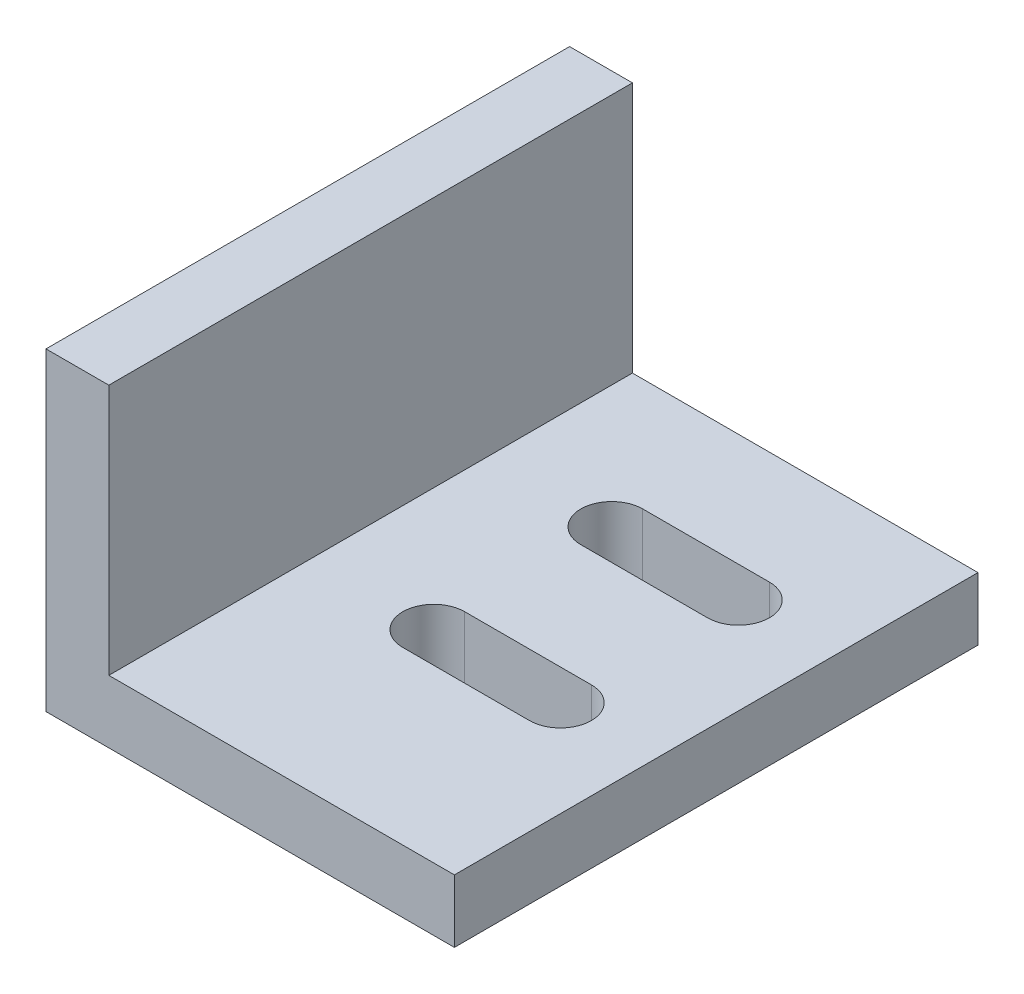
ISO-10303-21;
HEADER;
FILE_DESCRIPTION(('STEP AP214'),'2;1');
FILE_NAME('part.step','',(''),(''),'','','');
FILE_SCHEMA(('AUTOMOTIVE_DESIGN { 1 0 10303 214 1 1 1 1 }'));
ENDSEC;
DATA;
#1=APPLICATION_CONTEXT('core data for automotive mechanical design processes');
#2=APPLICATION_PROTOCOL_DEFINITION('international standard','automotive_design',2000,#1);
#3=PRODUCT_CONTEXT('',#1,'mechanical');
#4=PRODUCT('Part','Part','',(#3));
#5=PRODUCT_RELATED_PRODUCT_CATEGORY('part','',(#4));
#6=PRODUCT_DEFINITION_FORMATION('','',#4);
#7=PRODUCT_DEFINITION_CONTEXT('part definition',#1,'design');
#8=PRODUCT_DEFINITION('design','',#6,#7);
#9=PRODUCT_DEFINITION_SHAPE('','',#8);
#10=(LENGTH_UNIT() NAMED_UNIT(*) SI_UNIT(.MILLI.,.METRE.));
#11=(NAMED_UNIT(*) PLANE_ANGLE_UNIT() SI_UNIT($,.RADIAN.));
#12=(NAMED_UNIT(*) SI_UNIT($,.STERADIAN.) SOLID_ANGLE_UNIT());
#13=UNCERTAINTY_MEASURE_WITH_UNIT(LENGTH_MEASURE(1.E-05),#10,'distance_accuracy_value','');
#14=(GEOMETRIC_REPRESENTATION_CONTEXT(3) GLOBAL_UNCERTAINTY_ASSIGNED_CONTEXT((#13)) GLOBAL_UNIT_ASSIGNED_CONTEXT((#10,
#11,#12)) REPRESENTATION_CONTEXT('',''));
#15=CARTESIAN_POINT('',(0.,0.,0.));
#16=DIRECTION('',(0.,0.,1.));
#17=DIRECTION('',(1.,0.,0.));
#18=AXIS2_PLACEMENT_3D('',#15,#16,#17);
#19=CARTESIAN_POINT('',(0.,6.,50.));
#20=DIRECTION('',(-1.,0.,0.));
#21=DIRECTION('',(0.,-1.,0.));
#22=AXIS2_PLACEMENT_3D('',#19,#20,#21);
#23=PLANE('',#22);
#24=DIRECTION('',(0.,1.,0.));
#25=VECTOR('',#24,1.);
#26=CARTESIAN_POINT('',(0.,6.,0.));
#27=LINE('',#26,#25);
#28=CARTESIAN_POINT('',(0.,0.,0.));
#29=VERTEX_POINT('',#28);
#30=CARTESIAN_POINT('',(0.,6.,0.));
#31=VERTEX_POINT('',#30);
#32=EDGE_CURVE('E206',#29,#31,#27,.T.);
#33=ORIENTED_EDGE('',*,*,#32,.T.);
#34=DIRECTION('',(0.,0.,-1.));
#35=VECTOR('',#34,1.);
#36=CARTESIAN_POINT('',(0.,6.,50.));
#37=LINE('',#36,#35);
#38=CARTESIAN_POINT('',(0.,6.,50.));
#39=VERTEX_POINT('',#38);
#40=EDGE_CURVE('E11',#39,#31,#37,.T.);
#41=ORIENTED_EDGE('',*,*,#40,.F.);
#42=DIRECTION('',(0.,1.,0.));
#43=VECTOR('',#42,1.);
#44=CARTESIAN_POINT('',(0.,6.,50.));
#45=LINE('',#44,#43);
#46=CARTESIAN_POINT('',(0.,0.,50.));
#47=VERTEX_POINT('',#46);
#48=EDGE_CURVE('E207',#47,#39,#45,.T.);
#49=ORIENTED_EDGE('',*,*,#48,.F.);
#50=DIRECTION('',(0.,0.,-1.));
#51=VECTOR('',#50,1.);
#52=CARTESIAN_POINT('',(0.,0.,50.));
#53=LINE('',#52,#51);
#54=EDGE_CURVE('E221',#47,#29,#53,.T.);
#55=ORIENTED_EDGE('',*,*,#54,.T.);
#56=EDGE_LOOP('',(#33,#41,#49,#55));
#57=FACE_BOUND('',#56,.T.);
#58=ADVANCED_FACE('F36',(#57),#23,.F.);
#59=CARTESIAN_POINT('',(-33.,6.,50.));
#60=DIRECTION('',(0.,-1.,0.));
#61=DIRECTION('',(0.,0.,-1.));
#62=AXIS2_PLACEMENT_3D('',#59,#60,#61);
#63=PLANE('',#62);
#64=DIRECTION('',(-1.,0.,0.));
#65=VECTOR('',#64,1.);
#66=CARTESIAN_POINT('',(-33.0000000000002,6.,33.6560327198366));
#67=LINE('',#66,#65);
#68=CARTESIAN_POINT('',(-9.17339689379935,6.,33.6560327198363));
#69=VERTEX_POINT('',#68);
#70=CARTESIAN_POINT('',(-21.2733968937993,6.,33.6560327198364));
#71=VERTEX_POINT('',#70);
#72=EDGE_CURVE('E200',#69,#71,#67,.T.);
#73=ORIENTED_EDGE('',*,*,#72,.T.);
#74=CARTESIAN_POINT('',(-21.2733968937993,6.,30.7));
#75=DIRECTION('',(0.,-1.,0.));
#76=DIRECTION('',(0.,0.,-1.));
#77=AXIS2_PLACEMENT_3D('',#74,#75,#76);
#78=CIRCLE('',#77,2.9560327198364);
#79=CARTESIAN_POINT('',(-21.2733968937993,6.,27.7439672801636));
#80=VERTEX_POINT('',#79);
#81=EDGE_CURVE('E203',#71,#80,#78,.T.);
#82=ORIENTED_EDGE('',*,*,#81,.T.);
#83=DIRECTION('',(1.,0.,0.));
#84=VECTOR('',#83,1.);
#85=CARTESIAN_POINT('',(-33.0000000000002,6.,27.7439672801638));
#86=LINE('',#85,#84);
#87=CARTESIAN_POINT('',(-9.17339689379937,6.,27.7439672801635));
#88=VERTEX_POINT('',#87);
#89=EDGE_CURVE('E197',#80,#88,#86,.T.);
#90=ORIENTED_EDGE('',*,*,#89,.T.);
#91=CARTESIAN_POINT('',(-9.17339689379936,6.,30.6999999999999));
#92=DIRECTION('',(0.,-1.,0.));
#93=DIRECTION('',(0.,0.,-1.));
#94=AXIS2_PLACEMENT_3D('',#91,#92,#93);
#95=CIRCLE('',#94,2.9560327198364);
#96=EDGE_CURVE('E141',#88,#69,#95,.T.);
#97=ORIENTED_EDGE('',*,*,#96,.T.);
#98=EDGE_LOOP('',(#73,#82,#90,#97));
#99=FACE_BOUND('',#98,.T.);
#100=DIRECTION('',(1.,0.,0.));
#101=VECTOR('',#100,1.);
#102=CARTESIAN_POINT('',(-33.0000000000004,6.,10.7439672801638));
#103=LINE('',#102,#101);
#104=CARTESIAN_POINT('',(-21.2733968937993,6.,10.7439672801636));
#105=VERTEX_POINT('',#104);
#106=CARTESIAN_POINT('',(-9.17339689379938,6.,10.7439672801635));
#107=VERTEX_POINT('',#106);
#108=EDGE_CURVE('E191',#105,#107,#103,.T.);
#109=ORIENTED_EDGE('',*,*,#108,.T.);
#110=CARTESIAN_POINT('',(-9.17339689379938,6.,13.6999999999999));
#111=DIRECTION('',(0.,-1.,0.));
#112=DIRECTION('',(0.,0.,-1.));
#113=AXIS2_PLACEMENT_3D('',#110,#111,#112);
#114=CIRCLE('',#113,2.9560327198364);
#115=CARTESIAN_POINT('',(-9.17339689379937,6.,16.6560327198363));
#116=VERTEX_POINT('',#115);
#117=EDGE_CURVE('E194',#107,#116,#114,.T.);
#118=ORIENTED_EDGE('',*,*,#117,.T.);
#119=DIRECTION('',(-1.,0.,0.));
#120=VECTOR('',#119,1.);
#121=CARTESIAN_POINT('',(-33.0000000000003,6.,16.6560327198366));
#122=LINE('',#121,#120);
#123=CARTESIAN_POINT('',(-21.2733968937993,6.,16.6560327198364));
#124=VERTEX_POINT('',#123);
#125=EDGE_CURVE('E165',#116,#124,#122,.T.);
#126=ORIENTED_EDGE('',*,*,#125,.T.);
#127=CARTESIAN_POINT('',(-21.2733968937993,6.,13.7));
#128=DIRECTION('',(0.,-1.,0.));
#129=DIRECTION('',(0.,0.,-1.));
#130=AXIS2_PLACEMENT_3D('',#127,#128,#129);
#131=CIRCLE('',#130,2.9560327198364);
#132=EDGE_CURVE('E188',#124,#105,#131,.T.);
#133=ORIENTED_EDGE('',*,*,#132,.T.);
#134=EDGE_LOOP('',(#109,#118,#126,#133));
#135=FACE_BOUND('',#134,.T.);
#136=DIRECTION('',(-1.,0.,0.));
#137=VECTOR('',#136,1.);
#138=CARTESIAN_POINT('',(-33.,6.,0.));
#139=LINE('',#138,#137);
#140=CARTESIAN_POINT('',(-33.,6.,0.));
#141=VERTEX_POINT('',#140);
#142=EDGE_CURVE('E224',#31,#141,#139,.T.);
#143=ORIENTED_EDGE('',*,*,#142,.T.);
#144=DIRECTION('',(0.,0.,-1.));
#145=VECTOR('',#144,1.);
#146=CARTESIAN_POINT('',(-33.,6.,50.));
#147=LINE('',#146,#145);
#148=CARTESIAN_POINT('',(-33.,6.,50.));
#149=VERTEX_POINT('',#148);
#150=EDGE_CURVE('E43',#149,#141,#147,.T.);
#151=ORIENTED_EDGE('',*,*,#150,.F.);
#152=DIRECTION('',(-1.,0.,0.));
#153=VECTOR('',#152,1.);
#154=CARTESIAN_POINT('',(-33.,6.,50.));
#155=LINE('',#154,#153);
#156=EDGE_CURVE('E210',#39,#149,#155,.T.);
#157=ORIENTED_EDGE('',*,*,#156,.F.);
#158=ORIENTED_EDGE('',*,*,#40,.T.);
#159=EDGE_LOOP('',(#143,#151,#157,#158));
#160=FACE_BOUND('',#159,.T.);
#161=ADVANCED_FACE('F271',(#99,#135,#160),#63,.F.);
#162=CARTESIAN_POINT('',(-33.,30.,50.));
#163=DIRECTION('',(-1.,0.,0.));
#164=DIRECTION('',(0.,-1.,0.));
#165=AXIS2_PLACEMENT_3D('',#162,#163,#164);
#166=PLANE('',#165);
#167=DIRECTION('',(0.,1.,0.));
#168=VECTOR('',#167,1.);
#169=CARTESIAN_POINT('',(-33.,30.,0.));
#170=LINE('',#169,#168);
#171=CARTESIAN_POINT('',(-33.,30.,0.));
#172=VERTEX_POINT('',#171);
#173=EDGE_CURVE('E226',#141,#172,#170,.T.);
#174=ORIENTED_EDGE('',*,*,#173,.T.);
#175=DIRECTION('',(0.,0.,-1.));
#176=VECTOR('',#175,1.);
#177=CARTESIAN_POINT('',(-33.,30.,50.));
#178=LINE('',#177,#176);
#179=CARTESIAN_POINT('',(-33.,30.,50.));
#180=VERTEX_POINT('',#179);
#181=EDGE_CURVE('E241',#180,#172,#178,.T.);
#182=ORIENTED_EDGE('',*,*,#181,.F.);
#183=DIRECTION('',(0.,1.,0.));
#184=VECTOR('',#183,1.);
#185=CARTESIAN_POINT('',(-33.,30.,50.));
#186=LINE('',#185,#184);
#187=EDGE_CURVE('E213',#149,#180,#186,.T.);
#188=ORIENTED_EDGE('',*,*,#187,.F.);
#189=ORIENTED_EDGE('',*,*,#150,.T.);
#190=EDGE_LOOP('',(#174,#182,#188,#189));
#191=FACE_BOUND('',#190,.T.);
#192=ADVANCED_FACE('F248',(#191),#166,.F.);
#193=CARTESIAN_POINT('',(-39.,30.,50.));
#194=DIRECTION('',(0.,-1.,0.));
#195=DIRECTION('',(0.,0.,-1.));
#196=AXIS2_PLACEMENT_3D('',#193,#194,#195);
#197=PLANE('',#196);
#198=DIRECTION('',(-1.,0.,0.));
#199=VECTOR('',#198,1.);
#200=CARTESIAN_POINT('',(-39.,30.,0.));
#201=LINE('',#200,#199);
#202=CARTESIAN_POINT('',(-39.,30.,0.));
#203=VERTEX_POINT('',#202);
#204=EDGE_CURVE('E228',#172,#203,#201,.T.);
#205=ORIENTED_EDGE('',*,*,#204,.T.);
#206=DIRECTION('',(0.,0.,-1.));
#207=VECTOR('',#206,1.);
#208=CARTESIAN_POINT('',(-39.,30.,50.));
#209=LINE('',#208,#207);
#210=CARTESIAN_POINT('',(-39.,30.,50.));
#211=VERTEX_POINT('',#210);
#212=EDGE_CURVE('E238',#211,#203,#209,.T.);
#213=ORIENTED_EDGE('',*,*,#212,.F.);
#214=DIRECTION('',(-1.,0.,0.));
#215=VECTOR('',#214,1.);
#216=CARTESIAN_POINT('',(-39.,30.,50.));
#217=LINE('',#216,#215);
#218=EDGE_CURVE('E215',#180,#211,#217,.T.);
#219=ORIENTED_EDGE('',*,*,#218,.F.);
#220=ORIENTED_EDGE('',*,*,#181,.T.);
#221=EDGE_LOOP('',(#205,#213,#219,#220));
#222=FACE_BOUND('',#221,.T.);
#223=ADVANCED_FACE('F259',(#222),#197,.F.);
#224=CARTESIAN_POINT('',(-39.,0.,50.));
#225=DIRECTION('',(1.,0.,0.));
#226=DIRECTION('',(0.,1.,0.));
#227=AXIS2_PLACEMENT_3D('',#224,#225,#226);
#228=PLANE('',#227);
#229=DIRECTION('',(0.,-1.,0.));
#230=VECTOR('',#229,1.);
#231=CARTESIAN_POINT('',(-39.,0.,0.));
#232=LINE('',#231,#230);
#233=CARTESIAN_POINT('',(-39.,0.,0.));
#234=VERTEX_POINT('',#233);
#235=EDGE_CURVE('E230',#203,#234,#232,.T.);
#236=ORIENTED_EDGE('',*,*,#235,.T.);
#237=DIRECTION('',(0.,0.,-1.));
#238=VECTOR('',#237,1.);
#239=CARTESIAN_POINT('',(-39.,0.,50.));
#240=LINE('',#239,#238);
#241=CARTESIAN_POINT('',(-39.,0.,50.));
#242=VERTEX_POINT('',#241);
#243=EDGE_CURVE('E235',#242,#234,#240,.T.);
#244=ORIENTED_EDGE('',*,*,#243,.F.);
#245=DIRECTION('',(0.,-1.,0.));
#246=VECTOR('',#245,1.);
#247=CARTESIAN_POINT('',(-39.,0.,50.));
#248=LINE('',#247,#246);
#249=EDGE_CURVE('E217',#211,#242,#248,.T.);
#250=ORIENTED_EDGE('',*,*,#249,.F.);
#251=ORIENTED_EDGE('',*,*,#212,.T.);
#252=EDGE_LOOP('',(#236,#244,#250,#251));
#253=FACE_BOUND('',#252,.T.);
#254=ADVANCED_FACE('F263',(#253),#228,.F.);
#255=CARTESIAN_POINT('',(0.,0.,50.));
#256=DIRECTION('',(0.,1.,0.));
#257=DIRECTION('',(-1.,0.,0.));
#258=AXIS2_PLACEMENT_3D('',#255,#256,#257);
#259=PLANE('',#258);
#260=DIRECTION('',(1.,0.,0.));
#261=VECTOR('',#260,1.);
#262=CARTESIAN_POINT('',(-9.17339689379937,0.,27.7439672801635));
#263=LINE('',#262,#261);
#264=CARTESIAN_POINT('',(-21.2733968937993,0.,27.7439672801636));
#265=VERTEX_POINT('',#264);
#266=CARTESIAN_POINT('',(-9.17339689379937,0.,27.7439672801635));
#267=VERTEX_POINT('',#266);
#268=EDGE_CURVE('E148',#265,#267,#263,.T.);
#269=ORIENTED_EDGE('',*,*,#268,.F.);
#270=CARTESIAN_POINT('',(-21.2733968937993,0.,30.7));
#271=DIRECTION('',(0.,-1.,0.));
#272=DIRECTION('',(-1.,0.,0.));
#273=AXIS2_PLACEMENT_3D('',#270,#271,#272);
#274=CIRCLE('',#273,2.9560327198364);
#275=CARTESIAN_POINT('',(-21.2733968937993,0.,33.6560327198364));
#276=VERTEX_POINT('',#275);
#277=EDGE_CURVE('E153',#276,#265,#274,.T.);
#278=ORIENTED_EDGE('',*,*,#277,.F.);
#279=DIRECTION('',(-1.,0.,0.));
#280=VECTOR('',#279,1.);
#281=CARTESIAN_POINT('',(-21.2733968937993,0.,33.6560327198364));
#282=LINE('',#281,#280);
#283=CARTESIAN_POINT('',(-9.17339689379935,0.,33.6560327198363));
#284=VERTEX_POINT('',#283);
#285=EDGE_CURVE('E158',#284,#276,#282,.T.);
#286=ORIENTED_EDGE('',*,*,#285,.F.);
#287=CARTESIAN_POINT('',(-9.17339689379936,0.,30.6999999999999));
#288=DIRECTION('',(0.,-1.,0.));
#289=DIRECTION('',(1.,0.,0.));
#290=AXIS2_PLACEMENT_3D('',#287,#288,#289);
#291=CIRCLE('',#290,2.9560327198364);
#292=EDGE_CURVE('E138',#267,#284,#291,.T.);
#293=ORIENTED_EDGE('',*,*,#292,.F.);
#294=EDGE_LOOP('',(#269,#278,#286,#293));
#295=FACE_BOUND('',#294,.T.);
#296=DIRECTION('',(-1.,0.,0.));
#297=VECTOR('',#296,1.);
#298=CARTESIAN_POINT('',(-21.2733968937993,0.,16.6560327198364));
#299=LINE('',#298,#297);
#300=CARTESIAN_POINT('',(-9.17339689379937,0.,16.6560327198363));
#301=VERTEX_POINT('',#300);
#302=CARTESIAN_POINT('',(-21.2733968937993,0.,16.6560327198364));
#303=VERTEX_POINT('',#302);
#304=EDGE_CURVE('E170',#301,#303,#299,.T.);
#305=ORIENTED_EDGE('',*,*,#304,.F.);
#306=CARTESIAN_POINT('',(-9.17339689379938,0.,13.6999999999999));
#307=DIRECTION('',(0.,-1.,0.));
#308=DIRECTION('',(1.,0.,0.));
#309=AXIS2_PLACEMENT_3D('',#306,#307,#308);
#310=CIRCLE('',#309,2.9560327198364);
#311=CARTESIAN_POINT('',(-9.17339689379938,0.,10.7439672801635));
#312=VERTEX_POINT('',#311);
#313=EDGE_CURVE('E168',#312,#301,#310,.T.);
#314=ORIENTED_EDGE('',*,*,#313,.F.);
#315=DIRECTION('',(1.,0.,0.));
#316=VECTOR('',#315,1.);
#317=CARTESIAN_POINT('',(-9.17339689379938,0.,10.7439672801635));
#318=LINE('',#317,#316);
#319=CARTESIAN_POINT('',(-21.2733968937993,0.,10.7439672801636));
#320=VERTEX_POINT('',#319);
#321=EDGE_CURVE('E175',#320,#312,#318,.T.);
#322=ORIENTED_EDGE('',*,*,#321,.F.);
#323=CARTESIAN_POINT('',(-21.2733968937993,0.,13.7));
#324=DIRECTION('',(0.,-1.,0.));
#325=DIRECTION('',(-1.,0.,0.));
#326=AXIS2_PLACEMENT_3D('',#323,#324,#325);
#327=CIRCLE('',#326,2.9560327198364);
#328=EDGE_CURVE('E172',#303,#320,#327,.T.);
#329=ORIENTED_EDGE('',*,*,#328,.F.);
#330=EDGE_LOOP('',(#305,#314,#322,#329));
#331=FACE_BOUND('',#330,.T.);
#332=DIRECTION('',(1.,0.,0.));
#333=VECTOR('',#332,1.);
#334=CARTESIAN_POINT('',(0.,0.,0.));
#335=LINE('',#334,#333);
#336=EDGE_CURVE('E211',#234,#29,#335,.T.);
#337=ORIENTED_EDGE('',*,*,#336,.T.);
#338=ORIENTED_EDGE('',*,*,#54,.F.);
#339=DIRECTION('',(1.,0.,0.));
#340=VECTOR('',#339,1.);
#341=CARTESIAN_POINT('',(0.,0.,50.));
#342=LINE('',#341,#340);
#343=EDGE_CURVE('E219',#242,#47,#342,.T.);
#344=ORIENTED_EDGE('',*,*,#343,.F.);
#345=ORIENTED_EDGE('',*,*,#243,.T.);
#346=EDGE_LOOP('',(#337,#338,#344,#345));
#347=FACE_BOUND('',#346,.T.);
#348=ADVANCED_FACE('F155',(#295,#331,#347),#259,.F.);
#349=CARTESIAN_POINT('',(0.,0.,50.));
#350=DIRECTION('',(0.,0.,-1.));
#351=DIRECTION('',(-1.,0.,0.));
#352=AXIS2_PLACEMENT_3D('',#349,#350,#351);
#353=PLANE('',#352);
#354=ORIENTED_EDGE('',*,*,#48,.T.);
#355=ORIENTED_EDGE('',*,*,#156,.T.);
#356=ORIENTED_EDGE('',*,*,#187,.T.);
#357=ORIENTED_EDGE('',*,*,#218,.T.);
#358=ORIENTED_EDGE('',*,*,#249,.T.);
#359=ORIENTED_EDGE('',*,*,#343,.T.);
#360=EDGE_LOOP('',(#354,#355,#356,#357,#358,#359));
#361=FACE_BOUND('',#360,.T.);
#362=ADVANCED_FACE('F267',(#361),#353,.F.);
#363=CARTESIAN_POINT('',(0.,0.,0.));
#364=DIRECTION('',(0.,0.,-1.));
#365=DIRECTION('',(-1.,0.,0.));
#366=AXIS2_PLACEMENT_3D('',#363,#364,#365);
#367=PLANE('',#366);
#368=ORIENTED_EDGE('',*,*,#32,.F.);
#369=ORIENTED_EDGE('',*,*,#336,.F.);
#370=ORIENTED_EDGE('',*,*,#235,.F.);
#371=ORIENTED_EDGE('',*,*,#204,.F.);
#372=ORIENTED_EDGE('',*,*,#173,.F.);
#373=ORIENTED_EDGE('',*,*,#142,.F.);
#374=EDGE_LOOP('',(#368,#369,#370,#371,#372,#373));
#375=FACE_BOUND('',#374,.T.);
#376=ADVANCED_FACE('F254',(#375),#367,.T.);
#377=CARTESIAN_POINT('',(-9.17339689379938,14.,13.6999999999999));
#378=DIRECTION('',(0.,-1.,0.));
#379=DIRECTION('',(1.,0.,0.));
#380=AXIS2_PLACEMENT_3D('',#377,#378,#379);
#381=CYLINDRICAL_SURFACE('',#380,2.9560327198364);
#382=DIRECTION('',(0.,-1.,0.));
#383=VECTOR('',#382,1.);
#384=CARTESIAN_POINT('',(-9.17339689379939,14.,10.7439672801635));
#385=LINE('',#384,#383);
#386=EDGE_CURVE('E179',#107,#312,#385,.T.);
#387=ORIENTED_EDGE('',*,*,#386,.T.);
#388=ORIENTED_EDGE('',*,*,#313,.T.);
#389=DIRECTION('',(0.,-1.,0.));
#390=VECTOR('',#389,1.);
#391=CARTESIAN_POINT('',(-9.17339689379937,14.,16.6560327198363));
#392=LINE('',#391,#390);
#393=EDGE_CURVE('E178',#116,#301,#392,.T.);
#394=ORIENTED_EDGE('',*,*,#393,.F.);
#395=ORIENTED_EDGE('',*,*,#117,.F.);
#396=EDGE_LOOP('',(#387,#388,#394,#395));
#397=FACE_BOUND('',#396,.T.);
#398=ADVANCED_FACE('F319',(#397),#381,.F.);
#399=CARTESIAN_POINT('',(-9.17339689379939,14.,10.7439672801635));
#400=DIRECTION('',(0.,0.,-1.));
#401=DIRECTION('',(-1.,0.,0.));
#402=AXIS2_PLACEMENT_3D('',#399,#400,#401);
#403=PLANE('',#402);
#404=DIRECTION('',(0.,-1.,0.));
#405=VECTOR('',#404,1.);
#406=CARTESIAN_POINT('',(-21.2733968937993,14.,10.7439672801636));
#407=LINE('',#406,#405);
#408=EDGE_CURVE('E181',#105,#320,#407,.T.);
#409=ORIENTED_EDGE('',*,*,#408,.T.);
#410=ORIENTED_EDGE('',*,*,#321,.T.);
#411=ORIENTED_EDGE('',*,*,#386,.F.);
#412=ORIENTED_EDGE('',*,*,#108,.F.);
#413=EDGE_LOOP('',(#409,#410,#411,#412));
#414=FACE_BOUND('',#413,.T.);
#415=ADVANCED_FACE('F337',(#414),#403,.F.);
#416=CARTESIAN_POINT('',(-21.2733968937993,14.,13.7));
#417=DIRECTION('',(0.,-1.,0.));
#418=DIRECTION('',(1.,0.,0.));
#419=AXIS2_PLACEMENT_3D('',#416,#417,#418);
#420=CYLINDRICAL_SURFACE('',#419,2.9560327198364);
#421=DIRECTION('',(0.,-1.,0.));
#422=VECTOR('',#421,1.);
#423=CARTESIAN_POINT('',(-21.2733968937993,14.,16.6560327198364));
#424=LINE('',#423,#422);
#425=EDGE_CURVE('E58',#124,#303,#424,.T.);
#426=ORIENTED_EDGE('',*,*,#425,.T.);
#427=ORIENTED_EDGE('',*,*,#328,.T.);
#428=ORIENTED_EDGE('',*,*,#408,.F.);
#429=ORIENTED_EDGE('',*,*,#132,.F.);
#430=EDGE_LOOP('',(#426,#427,#428,#429));
#431=FACE_BOUND('',#430,.T.);
#432=ADVANCED_FACE('F347',(#431),#420,.F.);
#433=CARTESIAN_POINT('',(-21.2733968937993,14.,16.6560327198364));
#434=DIRECTION('',(0.,0.,1.));
#435=DIRECTION('',(1.,0.,0.));
#436=AXIS2_PLACEMENT_3D('',#433,#434,#435);
#437=PLANE('',#436);
#438=ORIENTED_EDGE('',*,*,#393,.T.);
#439=ORIENTED_EDGE('',*,*,#304,.T.);
#440=ORIENTED_EDGE('',*,*,#425,.F.);
#441=ORIENTED_EDGE('',*,*,#125,.F.);
#442=EDGE_LOOP('',(#438,#439,#440,#441));
#443=FACE_BOUND('',#442,.T.);
#444=ADVANCED_FACE('F357',(#443),#437,.F.);
#445=CARTESIAN_POINT('',(-21.2733968937993,14.,30.7));
#446=DIRECTION('',(0.,-1.,0.));
#447=DIRECTION('',(1.,0.,0.));
#448=AXIS2_PLACEMENT_3D('',#445,#446,#447);
#449=CYLINDRICAL_SURFACE('',#448,2.9560327198364);
#450=DIRECTION('',(0.,-1.,0.));
#451=VECTOR('',#450,1.);
#452=CARTESIAN_POINT('',(-21.2733968937993,14.,33.6560327198364));
#453=LINE('',#452,#451);
#454=EDGE_CURVE('E163',#71,#276,#453,.T.);
#455=ORIENTED_EDGE('',*,*,#454,.T.);
#456=ORIENTED_EDGE('',*,*,#277,.T.);
#457=DIRECTION('',(0.,-1.,0.));
#458=VECTOR('',#457,1.);
#459=CARTESIAN_POINT('',(-21.2733968937993,14.,27.7439672801636));
#460=LINE('',#459,#458);
#461=EDGE_CURVE('E144',#80,#265,#460,.T.);
#462=ORIENTED_EDGE('',*,*,#461,.F.);
#463=ORIENTED_EDGE('',*,*,#81,.F.);
#464=EDGE_LOOP('',(#455,#456,#462,#463));
#465=FACE_BOUND('',#464,.T.);
#466=ADVANCED_FACE('F367',(#465),#449,.F.);
#467=CARTESIAN_POINT('',(-21.2733968937993,14.,33.6560327198364));
#468=DIRECTION('',(0.,0.,1.));
#469=DIRECTION('',(1.,0.,0.));
#470=AXIS2_PLACEMENT_3D('',#467,#468,#469);
#471=PLANE('',#470);
#472=DIRECTION('',(0.,-1.,0.));
#473=VECTOR('',#472,1.);
#474=CARTESIAN_POINT('',(-9.17339689379936,14.,33.6560327198363));
#475=LINE('',#474,#473);
#476=EDGE_CURVE('E143',#69,#284,#475,.T.);
#477=ORIENTED_EDGE('',*,*,#476,.T.);
#478=ORIENTED_EDGE('',*,*,#285,.T.);
#479=ORIENTED_EDGE('',*,*,#454,.F.);
#480=ORIENTED_EDGE('',*,*,#72,.F.);
#481=EDGE_LOOP('',(#477,#478,#479,#480));
#482=FACE_BOUND('',#481,.T.);
#483=ADVANCED_FACE('F376',(#482),#471,.F.);
#484=CARTESIAN_POINT('',(-9.17339689379936,14.,30.6999999999999));
#485=DIRECTION('',(0.,-1.,0.));
#486=DIRECTION('',(1.,0.,0.));
#487=AXIS2_PLACEMENT_3D('',#484,#485,#486);
#488=CYLINDRICAL_SURFACE('',#487,2.9560327198364);
#489=DIRECTION('',(0.,-1.,0.));
#490=VECTOR('',#489,1.);
#491=CARTESIAN_POINT('',(-9.17339689379937,14.,27.7439672801635));
#492=LINE('',#491,#490);
#493=EDGE_CURVE('E50',#88,#267,#492,.T.);
#494=ORIENTED_EDGE('',*,*,#493,.T.);
#495=ORIENTED_EDGE('',*,*,#292,.T.);
#496=ORIENTED_EDGE('',*,*,#476,.F.);
#497=ORIENTED_EDGE('',*,*,#96,.F.);
#498=EDGE_LOOP('',(#494,#495,#496,#497));
#499=FACE_BOUND('',#498,.T.);
#500=ADVANCED_FACE('F135',(#499),#488,.F.);
#501=CARTESIAN_POINT('',(-9.17339689379937,14.,27.7439672801635));
#502=DIRECTION('',(0.,0.,-1.));
#503=DIRECTION('',(-1.,0.,0.));
#504=AXIS2_PLACEMENT_3D('',#501,#502,#503);
#505=PLANE('',#504);
#506=ORIENTED_EDGE('',*,*,#461,.T.);
#507=ORIENTED_EDGE('',*,*,#268,.T.);
#508=ORIENTED_EDGE('',*,*,#493,.F.);
#509=ORIENTED_EDGE('',*,*,#89,.F.);
#510=EDGE_LOOP('',(#506,#507,#508,#509));
#511=FACE_BOUND('',#510,.T.);
#512=ADVANCED_FACE('F149',(#511),#505,.F.);
#513=CLOSED_SHELL('',(#58,#161,#192,#223,#254,#348,#362,#376,#398,#415,#432,#444,#466,#483,#500,#512));
#514=MANIFOLD_SOLID_BREP('B2',#513);
#515=ADVANCED_BREP_SHAPE_REPRESENTATION('',(#18,#514),#14);
#516=SHAPE_DEFINITION_REPRESENTATION(#9,#515);
ENDSEC;
END-ISO-10303-21;
